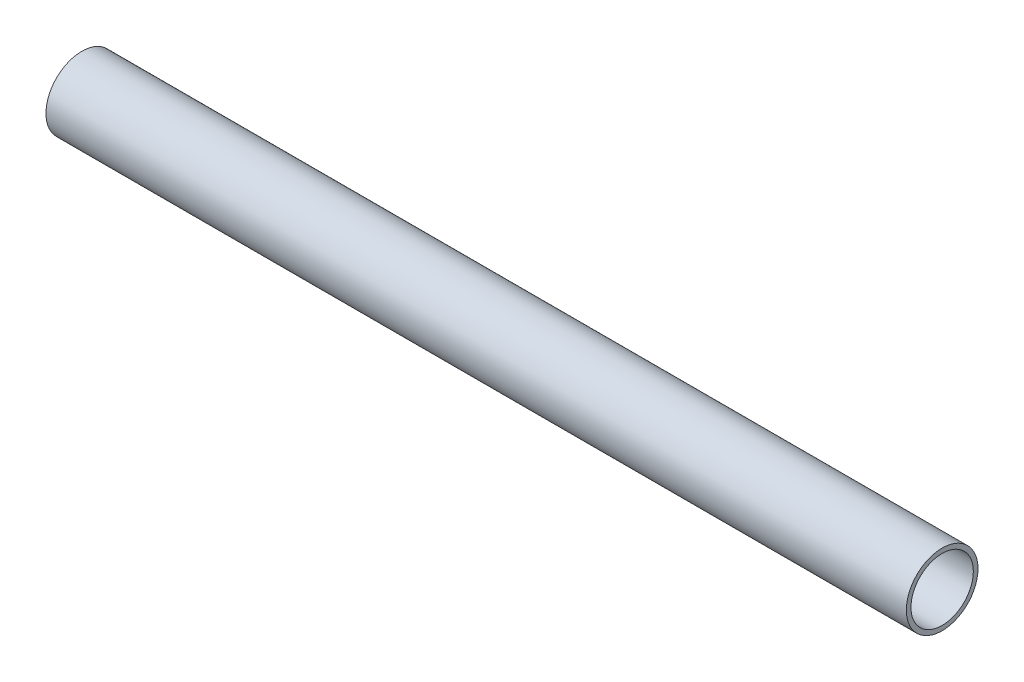
ISO-10303-21;
HEADER;
FILE_DESCRIPTION(('STEP AP214'),'2;1');
FILE_NAME('part.step','',(''),(''),'','','');
FILE_SCHEMA(('AUTOMOTIVE_DESIGN { 1 0 10303 214 1 1 1 1 }'));
ENDSEC;
DATA;
#1=APPLICATION_CONTEXT('core data for automotive mechanical design processes');
#2=APPLICATION_PROTOCOL_DEFINITION('international standard','automotive_design',2000,#1);
#3=PRODUCT_CONTEXT('',#1,'mechanical');
#4=PRODUCT('Part','Part','',(#3));
#5=PRODUCT_RELATED_PRODUCT_CATEGORY('part','',(#4));
#6=PRODUCT_DEFINITION_FORMATION('','',#4);
#7=PRODUCT_DEFINITION_CONTEXT('part definition',#1,'design');
#8=PRODUCT_DEFINITION('design','',#6,#7);
#9=PRODUCT_DEFINITION_SHAPE('','',#8);
#10=(LENGTH_UNIT() NAMED_UNIT(*) SI_UNIT(.MILLI.,.METRE.));
#11=(NAMED_UNIT(*) PLANE_ANGLE_UNIT() SI_UNIT($,.RADIAN.));
#12=(NAMED_UNIT(*) SI_UNIT($,.STERADIAN.) SOLID_ANGLE_UNIT());
#13=UNCERTAINTY_MEASURE_WITH_UNIT(LENGTH_MEASURE(1.E-05),#10,'distance_accuracy_value','');
#14=(GEOMETRIC_REPRESENTATION_CONTEXT(3) GLOBAL_UNCERTAINTY_ASSIGNED_CONTEXT((#13)) GLOBAL_UNIT_ASSIGNED_CONTEXT((#10,
#11,#12)) REPRESENTATION_CONTEXT('',''));
#15=CARTESIAN_POINT('',(0.,0.,0.));
#16=DIRECTION('',(0.,0.,1.));
#17=DIRECTION('',(1.,0.,0.));
#18=AXIS2_PLACEMENT_3D('',#15,#16,#17);
#19=CARTESIAN_POINT('',(-152.4,0.,0.));
#20=DIRECTION('',(1.,0.,0.));
#21=DIRECTION('',(0.,0.,-1.));
#22=AXIS2_PLACEMENT_3D('',#19,#20,#21);
#23=CYLINDRICAL_SURFACE('',#22,12.7);
#24=CARTESIAN_POINT('',(-152.4,0.,0.));
#25=DIRECTION('',(1.,0.,0.));
#26=DIRECTION('',(0.,0.,-1.));
#27=AXIS2_PLACEMENT_3D('',#24,#25,#26);
#28=CIRCLE('',#27,12.7);
#29=CARTESIAN_POINT('',(-152.4,0.,-12.7));
#30=VERTEX_POINT('',#29);
#31=EDGE_CURVE('E10',#30,#30,#28,.T.);
#32=CARTESIAN_POINT('',(152.4,0.,0.));
#33=DIRECTION('',(1.,0.,0.));
#34=DIRECTION('',(0.,0.,-1.));
#35=AXIS2_PLACEMENT_3D('',#32,#33,#34);
#36=CIRCLE('',#35,12.7);
#37=CARTESIAN_POINT('',(152.4,0.,-12.7));
#38=VERTEX_POINT('',#37);
#39=EDGE_CURVE('E46',#38,#38,#36,.T.);
#40=CARTESIAN_POINT('',(-152.4,0.,-12.7));
#41=CARTESIAN_POINT('',(-149.225,0.,-12.7));
#42=CARTESIAN_POINT('',(-146.05,0.,-12.7));
#43=CARTESIAN_POINT('',(-139.7,0.,-12.7));
#44=CARTESIAN_POINT('',(-136.525,0.,-12.7));
#45=CARTESIAN_POINT('',(-130.175,0.,-12.7));
#46=CARTESIAN_POINT('',(-127.,0.,-12.7));
#47=CARTESIAN_POINT('',(-120.65,0.,-12.7));
#48=CARTESIAN_POINT('',(-117.475,0.,-12.7));
#49=CARTESIAN_POINT('',(-111.125,0.,-12.7));
#50=CARTESIAN_POINT('',(-107.95,0.,-12.7));
#51=CARTESIAN_POINT('',(-101.6,0.,-12.7));
#52=CARTESIAN_POINT('',(-98.425,0.,-12.7));
#53=CARTESIAN_POINT('',(-92.075,0.,-12.7));
#54=CARTESIAN_POINT('',(-88.9,0.,-12.7));
#55=CARTESIAN_POINT('',(-82.55,0.,-12.7));
#56=CARTESIAN_POINT('',(-79.375,0.,-12.7));
#57=CARTESIAN_POINT('',(-73.025,0.,-12.7));
#58=CARTESIAN_POINT('',(-69.85,0.,-12.7));
#59=CARTESIAN_POINT('',(-63.5,0.,-12.7));
#60=CARTESIAN_POINT('',(-60.325,0.,-12.7));
#61=CARTESIAN_POINT('',(-53.975,0.,-12.7));
#62=CARTESIAN_POINT('',(-50.8,0.,-12.7));
#63=CARTESIAN_POINT('',(-44.45,0.,-12.7));
#64=CARTESIAN_POINT('',(-41.275,0.,-12.7));
#65=CARTESIAN_POINT('',(-34.925,0.,-12.7));
#66=CARTESIAN_POINT('',(-31.75,0.,-12.7));
#67=CARTESIAN_POINT('',(-25.4,0.,-12.7));
#68=CARTESIAN_POINT('',(-22.225,0.,-12.7));
#69=CARTESIAN_POINT('',(-15.875,0.,-12.7));
#70=CARTESIAN_POINT('',(-12.7,0.,-12.7));
#71=CARTESIAN_POINT('',(-6.35000000000003,0.,-12.7));
#72=CARTESIAN_POINT('',(-3.17500000000003,0.,-12.7));
#73=CARTESIAN_POINT('',(3.17499999999997,0.,-12.7));
#74=CARTESIAN_POINT('',(6.34999999999998,0.,-12.7));
#75=CARTESIAN_POINT('',(12.7,0.,-12.7));
#76=CARTESIAN_POINT('',(15.875,0.,-12.7));
#77=CARTESIAN_POINT('',(22.225,0.,-12.7));
#78=CARTESIAN_POINT('',(25.4,0.,-12.7));
#79=CARTESIAN_POINT('',(31.75,0.,-12.7));
#80=CARTESIAN_POINT('',(34.925,0.,-12.7));
#81=CARTESIAN_POINT('',(41.275,0.,-12.7));
#82=CARTESIAN_POINT('',(44.45,0.,-12.7));
#83=CARTESIAN_POINT('',(50.8,0.,-12.7));
#84=CARTESIAN_POINT('',(53.975,0.,-12.7));
#85=CARTESIAN_POINT('',(60.325,0.,-12.7));
#86=CARTESIAN_POINT('',(63.5,0.,-12.7));
#87=CARTESIAN_POINT('',(69.85,0.,-12.7));
#88=CARTESIAN_POINT('',(73.025,0.,-12.7));
#89=CARTESIAN_POINT('',(79.375,0.,-12.7));
#90=CARTESIAN_POINT('',(82.55,0.,-12.7));
#91=CARTESIAN_POINT('',(88.9,0.,-12.7));
#92=CARTESIAN_POINT('',(92.075,0.,-12.7));
#93=CARTESIAN_POINT('',(98.425,0.,-12.7));
#94=CARTESIAN_POINT('',(101.6,0.,-12.7));
#95=CARTESIAN_POINT('',(107.95,0.,-12.7));
#96=CARTESIAN_POINT('',(111.125,0.,-12.7));
#97=CARTESIAN_POINT('',(117.475,0.,-12.7));
#98=CARTESIAN_POINT('',(120.65,0.,-12.7));
#99=CARTESIAN_POINT('',(127.,0.,-12.7));
#100=CARTESIAN_POINT('',(130.175,0.,-12.7));
#101=CARTESIAN_POINT('',(136.525,0.,-12.7));
#102=CARTESIAN_POINT('',(139.7,0.,-12.7));
#103=CARTESIAN_POINT('',(146.05,0.,-12.7));
#104=CARTESIAN_POINT('',(149.225,0.,-12.7));
#105=CARTESIAN_POINT('',(152.4,0.,-12.7));
#106=B_SPLINE_CURVE_WITH_KNOTS('',3,(#40,#41,#42,#43,#44,#45,#46,#47,#48,#49,#50,#51,#52,#53,
#54,#55,#56,#57,#58,#59,#60,#61,#62,#63,#64,#65,#66,#67,#68,#69,#70,#71,#72,#73,#74,#75,#76,#77,
#78,#79,#80,#81,#82,#83,#84,#85,#86,#87,#88,#89,#90,#91,#92,#93,#94,#95,#96,#97,#98,#99,#100,
#101,#102,#103,#104,#105),.UNSPECIFIED.,.F.,.F.,(4,2,2,2,2,2,2,2,2,2,2,2,2,2,2,2,2,2,2,2,2,2,2,
2,2,2,2,2,2,2,2,2,4),(0.,9.52500000000001,19.05,28.575,38.1,47.625,57.15,66.675,76.2,85.725,
95.25,104.775,114.3,123.825,133.35,142.875,152.4,161.925,171.45,180.975,190.5,200.025,209.55,
219.075,228.6,238.125,247.65,257.175,266.7,276.225,285.75,295.275,304.8),.UNSPECIFIED.);
#107=EDGE_CURVE('BSEAM36',#30,#38,#106,.T.);
#108=ORIENTED_EDGE('',*,*,#31,.T.);
#109=ORIENTED_EDGE('',*,*,#39,.F.);
#110=ORIENTED_EDGE('',*,*,#107,.T.);
#111=ORIENTED_EDGE('',*,*,#107,.F.);
#112=EDGE_LOOP('',(#108,#110,#109,#111));
#113=FACE_BOUND('',#112,.T.);
#114=ADVANCED_FACE('F36',(#113),#23,.T.);
#115=CARTESIAN_POINT('',(-152.4,0.,0.));
#116=DIRECTION('',(1.,0.,0.));
#117=DIRECTION('',(0.,0.,-1.));
#118=AXIS2_PLACEMENT_3D('',#115,#116,#117);
#119=PLANE('',#118);
#120=CARTESIAN_POINT('',(-152.4,0.,0.));
#121=DIRECTION('',(1.,0.,0.));
#122=DIRECTION('',(0.,0.,-1.));
#123=AXIS2_PLACEMENT_3D('',#120,#121,#122);
#124=CIRCLE('',#123,11.049);
#125=CARTESIAN_POINT('',(-152.4,0.,-11.049));
#126=VERTEX_POINT('',#125);
#127=EDGE_CURVE('E42',#126,#126,#124,.T.);
#128=ORIENTED_EDGE('',*,*,#127,.T.);
#129=EDGE_LOOP('',(#128));
#130=FACE_BOUND('',#129,.T.);
#131=ORIENTED_EDGE('',*,*,#31,.F.);
#132=EDGE_LOOP('',(#131));
#133=FACE_BOUND('',#132,.T.);
#134=ADVANCED_FACE('F65',(#130,#133),#119,.F.);
#135=CARTESIAN_POINT('',(-152.4,0.,0.));
#136=DIRECTION('',(1.,0.,0.));
#137=DIRECTION('',(0.,0.,-1.));
#138=AXIS2_PLACEMENT_3D('',#135,#136,#137);
#139=CYLINDRICAL_SURFACE('',#138,11.049);
#140=CARTESIAN_POINT('',(152.4,0.,0.));
#141=DIRECTION('',(1.,0.,0.));
#142=DIRECTION('',(0.,0.,-1.));
#143=AXIS2_PLACEMENT_3D('',#140,#141,#142);
#144=CIRCLE('',#143,11.049);
#145=CARTESIAN_POINT('',(152.4,0.,-11.049));
#146=VERTEX_POINT('',#145);
#147=EDGE_CURVE('E50',#146,#146,#144,.T.);
#148=CARTESIAN_POINT('',(-152.4,0.,-11.049));
#149=CARTESIAN_POINT('',(-149.225,0.,-11.049));
#150=CARTESIAN_POINT('',(-146.05,0.,-11.049));
#151=CARTESIAN_POINT('',(-139.7,0.,-11.049));
#152=CARTESIAN_POINT('',(-136.525,0.,-11.049));
#153=CARTESIAN_POINT('',(-130.175,0.,-11.049));
#154=CARTESIAN_POINT('',(-127.,0.,-11.049));
#155=CARTESIAN_POINT('',(-120.65,0.,-11.049));
#156=CARTESIAN_POINT('',(-117.475,0.,-11.049));
#157=CARTESIAN_POINT('',(-111.125,0.,-11.049));
#158=CARTESIAN_POINT('',(-107.95,0.,-11.049));
#159=CARTESIAN_POINT('',(-101.6,0.,-11.049));
#160=CARTESIAN_POINT('',(-98.425,0.,-11.049));
#161=CARTESIAN_POINT('',(-92.075,0.,-11.049));
#162=CARTESIAN_POINT('',(-88.9,0.,-11.049));
#163=CARTESIAN_POINT('',(-82.55,0.,-11.049));
#164=CARTESIAN_POINT('',(-79.375,0.,-11.049));
#165=CARTESIAN_POINT('',(-73.025,0.,-11.049));
#166=CARTESIAN_POINT('',(-69.85,0.,-11.049));
#167=CARTESIAN_POINT('',(-63.5,0.,-11.049));
#168=CARTESIAN_POINT('',(-60.325,0.,-11.049));
#169=CARTESIAN_POINT('',(-53.975,0.,-11.049));
#170=CARTESIAN_POINT('',(-50.8,0.,-11.049));
#171=CARTESIAN_POINT('',(-44.45,0.,-11.049));
#172=CARTESIAN_POINT('',(-41.275,0.,-11.049));
#173=CARTESIAN_POINT('',(-34.925,0.,-11.049));
#174=CARTESIAN_POINT('',(-31.75,0.,-11.049));
#175=CARTESIAN_POINT('',(-25.4,0.,-11.049));
#176=CARTESIAN_POINT('',(-22.225,0.,-11.049));
#177=CARTESIAN_POINT('',(-15.875,0.,-11.049));
#178=CARTESIAN_POINT('',(-12.7,0.,-11.049));
#179=CARTESIAN_POINT('',(-6.35,0.,-11.049));
#180=CARTESIAN_POINT('',(-3.175,0.,-11.049));
#181=CARTESIAN_POINT('',(3.175,0.,-11.049));
#182=CARTESIAN_POINT('',(6.35,0.,-11.049));
#183=CARTESIAN_POINT('',(12.7,0.,-11.049));
#184=CARTESIAN_POINT('',(15.875,0.,-11.049));
#185=CARTESIAN_POINT('',(22.225,0.,-11.049));
#186=CARTESIAN_POINT('',(25.4,0.,-11.049));
#187=CARTESIAN_POINT('',(31.75,0.,-11.049));
#188=CARTESIAN_POINT('',(34.925,0.,-11.049));
#189=CARTESIAN_POINT('',(41.275,0.,-11.049));
#190=CARTESIAN_POINT('',(44.45,0.,-11.049));
#191=CARTESIAN_POINT('',(50.8,0.,-11.049));
#192=CARTESIAN_POINT('',(53.975,0.,-11.049));
#193=CARTESIAN_POINT('',(60.325,0.,-11.049));
#194=CARTESIAN_POINT('',(63.5,0.,-11.049));
#195=CARTESIAN_POINT('',(69.85,0.,-11.049));
#196=CARTESIAN_POINT('',(73.025,0.,-11.049));
#197=CARTESIAN_POINT('',(79.375,0.,-11.049));
#198=CARTESIAN_POINT('',(82.55,0.,-11.049));
#199=CARTESIAN_POINT('',(88.9,0.,-11.049));
#200=CARTESIAN_POINT('',(92.075,0.,-11.049));
#201=CARTESIAN_POINT('',(98.425,0.,-11.049));
#202=CARTESIAN_POINT('',(101.6,0.,-11.049));
#203=CARTESIAN_POINT('',(107.95,0.,-11.049));
#204=CARTESIAN_POINT('',(111.125,0.,-11.049));
#205=CARTESIAN_POINT('',(117.475,0.,-11.049));
#206=CARTESIAN_POINT('',(120.65,0.,-11.049));
#207=CARTESIAN_POINT('',(127.,0.,-11.049));
#208=CARTESIAN_POINT('',(130.175,0.,-11.049));
#209=CARTESIAN_POINT('',(136.525,0.,-11.049));
#210=CARTESIAN_POINT('',(139.7,0.,-11.049));
#211=CARTESIAN_POINT('',(146.05,0.,-11.049));
#212=CARTESIAN_POINT('',(149.225,0.,-11.049));
#213=CARTESIAN_POINT('',(152.4,0.,-11.049));
#214=B_SPLINE_CURVE_WITH_KNOTS('',3,(#148,#149,#150,#151,#152,#153,#154,#155,#156,#157,#158,
#159,#160,#161,#162,#163,#164,#165,#166,#167,#168,#169,#170,#171,#172,#173,#174,#175,#176,#177,
#178,#179,#180,#181,#182,#183,#184,#185,#186,#187,#188,#189,#190,#191,#192,#193,#194,#195,#196,
#197,#198,#199,#200,#201,#202,#203,#204,#205,#206,#207,#208,#209,#210,#211,#212,#213),
.UNSPECIFIED.,.F.,.F.,(4,2,2,2,2,2,2,2,2,2,2,2,2,2,2,2,2,2,2,2,2,2,2,2,2,2,2,2,2,2,2,2,4),(0.,
9.52499999999998,19.05,28.575,38.1,47.625,57.15,66.675,76.2,85.725,95.25,104.775,114.3,123.825,
133.35,142.875,152.4,161.925,171.45,180.975,190.5,200.025,209.55,219.075,228.6,238.125,247.65,
257.175,266.7,276.225,285.75,295.275,304.8),.UNSPECIFIED.);
#215=EDGE_CURVE('BSEAM56',#126,#146,#214,.T.);
#216=ORIENTED_EDGE('',*,*,#127,.F.);
#217=ORIENTED_EDGE('',*,*,#147,.T.);
#218=ORIENTED_EDGE('',*,*,#215,.T.);
#219=ORIENTED_EDGE('',*,*,#215,.F.);
#220=EDGE_LOOP('',(#216,#218,#217,#219));
#221=FACE_BOUND('',#220,.T.);
#222=ADVANCED_FACE('F56',(#221),#139,.F.);
#223=CARTESIAN_POINT('',(152.4,0.,0.));
#224=DIRECTION('',(1.,0.,0.));
#225=DIRECTION('',(0.,0.,-1.));
#226=AXIS2_PLACEMENT_3D('',#223,#224,#225);
#227=PLANE('',#226);
#228=ORIENTED_EDGE('',*,*,#39,.T.);
#229=EDGE_LOOP('',(#228));
#230=FACE_BOUND('',#229,.T.);
#231=ORIENTED_EDGE('',*,*,#147,.F.);
#232=EDGE_LOOP('',(#231));
#233=FACE_BOUND('',#232,.T.);
#234=ADVANCED_FACE('F58',(#230,#233),#227,.T.);
#235=CLOSED_SHELL('',(#114,#134,#222,#234));
#236=MANIFOLD_SOLID_BREP('B2',#235);
#237=ADVANCED_BREP_SHAPE_REPRESENTATION('',(#18,#236),#14);
#238=SHAPE_DEFINITION_REPRESENTATION(#9,#237);
ENDSEC;
END-ISO-10303-21;
